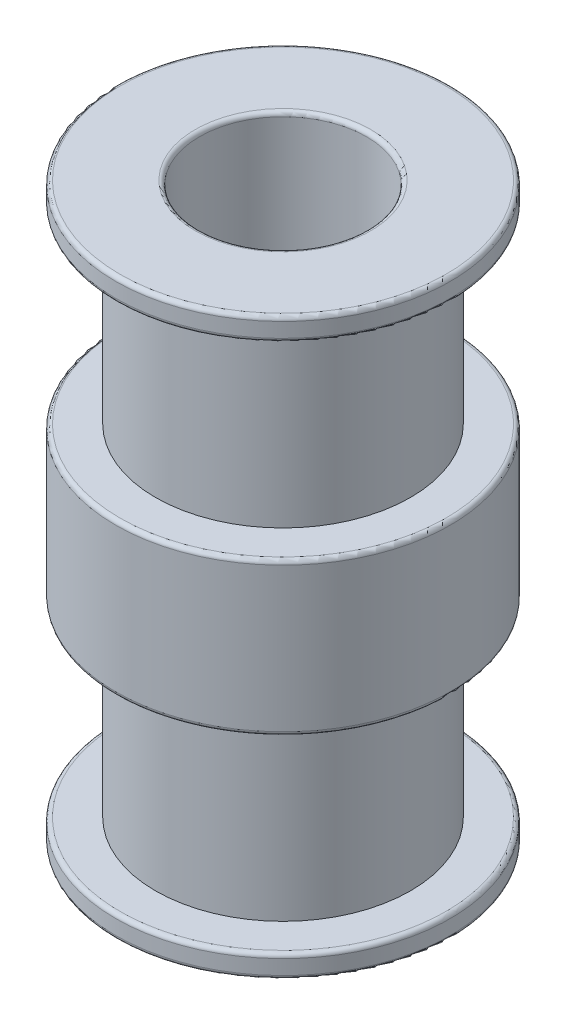
ISO-10303-21;
HEADER;
FILE_DESCRIPTION(('STEP AP214'),'2;1');
FILE_NAME('part.step','',(''),(''),'','','');
FILE_SCHEMA(('AUTOMOTIVE_DESIGN { 1 0 10303 214 1 1 1 1 }'));
ENDSEC;
DATA;
#1=APPLICATION_CONTEXT('core data for automotive mechanical design processes');
#2=APPLICATION_PROTOCOL_DEFINITION('international standard','automotive_design',2000,#1);
#3=PRODUCT_CONTEXT('',#1,'mechanical');
#4=PRODUCT('Part','Part','',(#3));
#5=PRODUCT_RELATED_PRODUCT_CATEGORY('part','',(#4));
#6=PRODUCT_DEFINITION_FORMATION('','',#4);
#7=PRODUCT_DEFINITION_CONTEXT('part definition',#1,'design');
#8=PRODUCT_DEFINITION('design','',#6,#7);
#9=PRODUCT_DEFINITION_SHAPE('','',#8);
#10=(LENGTH_UNIT() NAMED_UNIT(*) SI_UNIT(.MILLI.,.METRE.));
#11=(NAMED_UNIT(*) PLANE_ANGLE_UNIT() SI_UNIT($,.RADIAN.));
#12=(NAMED_UNIT(*) SI_UNIT($,.STERADIAN.) SOLID_ANGLE_UNIT());
#13=UNCERTAINTY_MEASURE_WITH_UNIT(LENGTH_MEASURE(1.E-05),#10,'distance_accuracy_value','');
#14=(GEOMETRIC_REPRESENTATION_CONTEXT(3) GLOBAL_UNCERTAINTY_ASSIGNED_CONTEXT((#13)) GLOBAL_UNIT_ASSIGNED_CONTEXT((#10,
#11,#12)) REPRESENTATION_CONTEXT('',''));
#15=CARTESIAN_POINT('',(0.,0.,0.));
#16=DIRECTION('',(0.,0.,1.));
#17=DIRECTION('',(1.,0.,0.));
#18=AXIS2_PLACEMENT_3D('',#15,#16,#17);
#19=CARTESIAN_POINT('',(0.,13.75,0.));
#20=DIRECTION('',(0.,-1.,0.));
#21=DIRECTION('',(0.,0.,-1.));
#22=AXIS2_PLACEMENT_3D('',#19,#20,#21);
#23=CYLINDRICAL_SURFACE('',#22,8.);
#24=CARTESIAN_POINT('',(0.,3.45,0.));
#25=DIRECTION('',(0.,1.,0.));
#26=DIRECTION('',(0.,0.,1.));
#27=AXIS2_PLACEMENT_3D('',#24,#25,#26);
#28=CIRCLE('',#27,8.);
#29=CARTESIAN_POINT('',(0.,3.45,8.));
#30=VERTEX_POINT('',#29);
#31=EDGE_CURVE('E44',#30,#30,#28,.F.);
#32=ORIENTED_EDGE('',*,*,#31,.T.);
#33=EDGE_LOOP('',(#32));
#34=FACE_BOUND('',#33,.T.);
#35=CARTESIAN_POINT('',(0.,-3.45,0.));
#36=DIRECTION('',(0.,-1.,0.));
#37=DIRECTION('',(0.,0.,-1.));
#38=AXIS2_PLACEMENT_3D('',#35,#36,#37);
#39=CIRCLE('',#38,8.);
#40=CARTESIAN_POINT('',(0.,-3.45,-8.));
#41=VERTEX_POINT('',#40);
#42=EDGE_CURVE('E47',#41,#41,#39,.F.);
#43=ORIENTED_EDGE('',*,*,#42,.T.);
#44=EDGE_LOOP('',(#43));
#45=FACE_BOUND('',#44,.T.);
#46=ADVANCED_FACE('F15',(#34,#45),#23,.T.);
#47=CARTESIAN_POINT('',(0.,-13.55,0.));
#48=DIRECTION('',(0.,1.,0.));
#49=DIRECTION('',(0.,0.,1.));
#50=AXIS2_PLACEMENT_3D('',#47,#48,#49);
#51=CIRCLE('',#50,8.);
#52=CARTESIAN_POINT('',(0.,-13.55,8.));
#53=VERTEX_POINT('',#52);
#54=EDGE_CURVE('E35',#53,#53,#51,.T.);
#55=ORIENTED_EDGE('',*,*,#54,.T.);
#56=EDGE_LOOP('',(#55));
#57=FACE_BOUND('',#56,.T.);
#58=CARTESIAN_POINT('',(0.,-12.85,0.));
#59=DIRECTION('',(0.,-1.,0.));
#60=DIRECTION('',(0.,0.,-1.));
#61=AXIS2_PLACEMENT_3D('',#58,#59,#60);
#62=CIRCLE('',#61,8.);
#63=CARTESIAN_POINT('',(0.,-12.85,-8.));
#64=VERTEX_POINT('',#63);
#65=EDGE_CURVE('E38',#64,#64,#62,.T.);
#66=ORIENTED_EDGE('',*,*,#65,.T.);
#67=EDGE_LOOP('',(#66));
#68=FACE_BOUND('',#67,.T.);
#69=ADVANCED_FACE('F107',(#57,#68),#23,.T.);
#70=CARTESIAN_POINT('',(0.,13.75,0.));
#71=DIRECTION('',(0.,1.,0.));
#72=DIRECTION('',(0.,0.,1.));
#73=AXIS2_PLACEMENT_3D('',#70,#71,#72);
#74=PLANE('',#73);
#75=CARTESIAN_POINT('',(0.,13.75,0.));
#76=DIRECTION('',(0.,1.,0.));
#77=DIRECTION('',(0.,0.,1.));
#78=AXIS2_PLACEMENT_3D('',#75,#76,#77);
#79=CIRCLE('',#78,4.2);
#80=CARTESIAN_POINT('',(0.,13.75,4.2));
#81=VERTEX_POINT('',#80);
#82=EDGE_CURVE('E53',#81,#81,#79,.F.);
#83=ORIENTED_EDGE('',*,*,#82,.T.);
#84=EDGE_LOOP('',(#83));
#85=FACE_BOUND('',#84,.T.);
#86=CARTESIAN_POINT('',(0.,13.75,0.));
#87=DIRECTION('',(0.,1.,0.));
#88=DIRECTION('',(0.,0.,1.));
#89=AXIS2_PLACEMENT_3D('',#86,#87,#88);
#90=CIRCLE('',#89,7.8);
#91=CARTESIAN_POINT('',(0.,13.75,7.8));
#92=VERTEX_POINT('',#91);
#93=EDGE_CURVE('E56',#92,#92,#90,.T.);
#94=ORIENTED_EDGE('',*,*,#93,.T.);
#95=EDGE_LOOP('',(#94));
#96=FACE_BOUND('',#95,.T.);
#97=ADVANCED_FACE('F115',(#85,#96),#74,.T.);
#98=CARTESIAN_POINT('',(0.,-13.75,0.));
#99=DIRECTION('',(0.,1.,0.));
#100=DIRECTION('',(0.,0.,1.));
#101=AXIS2_PLACEMENT_3D('',#98,#99,#100);
#102=PLANE('',#101);
#103=CARTESIAN_POINT('',(0.,-13.75,0.));
#104=DIRECTION('',(0.,1.,0.));
#105=DIRECTION('',(0.,0.,1.));
#106=AXIS2_PLACEMENT_3D('',#103,#104,#105);
#107=CIRCLE('',#106,4.2);
#108=CARTESIAN_POINT('',(0.,-13.75,4.2));
#109=VERTEX_POINT('',#108);
#110=EDGE_CURVE('E65',#109,#109,#107,.T.);
#111=ORIENTED_EDGE('',*,*,#110,.T.);
#112=EDGE_LOOP('',(#111));
#113=FACE_BOUND('',#112,.T.);
#114=CARTESIAN_POINT('',(0.,-13.75,0.));
#115=DIRECTION('',(0.,1.,0.));
#116=DIRECTION('',(0.,0.,1.));
#117=AXIS2_PLACEMENT_3D('',#114,#115,#116);
#118=CIRCLE('',#117,7.8);
#119=CARTESIAN_POINT('',(0.,-13.75,7.8));
#120=VERTEX_POINT('',#119);
#121=EDGE_CURVE('E68',#120,#120,#118,.F.);
#122=ORIENTED_EDGE('',*,*,#121,.T.);
#123=EDGE_LOOP('',(#122));
#124=FACE_BOUND('',#123,.T.);
#125=ADVANCED_FACE('F122',(#113,#124),#102,.F.);
#126=CARTESIAN_POINT('',(0.,12.85,0.));
#127=DIRECTION('',(0.,1.,0.));
#128=DIRECTION('',(0.,0.,1.));
#129=AXIS2_PLACEMENT_3D('',#126,#127,#128);
#130=CIRCLE('',#129,8.);
#131=CARTESIAN_POINT('',(0.,12.85,8.));
#132=VERTEX_POINT('',#131);
#133=EDGE_CURVE('E22',#132,#132,#130,.T.);
#134=ORIENTED_EDGE('',*,*,#133,.T.);
#135=EDGE_LOOP('',(#134));
#136=FACE_BOUND('',#135,.T.);
#137=CARTESIAN_POINT('',(0.,13.55,0.));
#138=DIRECTION('',(0.,1.,0.));
#139=DIRECTION('',(0.,0.,1.));
#140=AXIS2_PLACEMENT_3D('',#137,#138,#139);
#141=CIRCLE('',#140,8.);
#142=CARTESIAN_POINT('',(0.,13.55,8.));
#143=VERTEX_POINT('',#142);
#144=EDGE_CURVE('E26',#143,#143,#141,.F.);
#145=ORIENTED_EDGE('',*,*,#144,.T.);
#146=EDGE_LOOP('',(#145));
#147=FACE_BOUND('',#146,.T.);
#148=ADVANCED_FACE('F110',(#136,#147),#23,.T.);
#149=CARTESIAN_POINT('',(0.,13.75,0.));
#150=DIRECTION('',(0.,-1.,0.));
#151=DIRECTION('',(0.,0.,-1.));
#152=AXIS2_PLACEMENT_3D('',#149,#150,#151);
#153=CYLINDRICAL_SURFACE('',#152,4.);
#154=CARTESIAN_POINT('',(0.,-13.55,0.));
#155=DIRECTION('',(0.,1.,0.));
#156=DIRECTION('',(0.,0.,1.));
#157=AXIS2_PLACEMENT_3D('',#154,#155,#156);
#158=CIRCLE('',#157,4.);
#159=CARTESIAN_POINT('',(0.,-13.55,4.));
#160=VERTEX_POINT('',#159);
#161=EDGE_CURVE('E59',#160,#160,#158,.F.);
#162=ORIENTED_EDGE('',*,*,#161,.T.);
#163=EDGE_LOOP('',(#162));
#164=FACE_BOUND('',#163,.T.);
#165=CARTESIAN_POINT('',(0.,13.55,0.));
#166=DIRECTION('',(0.,1.,0.));
#167=DIRECTION('',(0.,0.,1.));
#168=AXIS2_PLACEMENT_3D('',#165,#166,#167);
#169=CIRCLE('',#168,4.);
#170=CARTESIAN_POINT('',(0.,13.55,4.));
#171=VERTEX_POINT('',#170);
#172=EDGE_CURVE('E62',#171,#171,#169,.T.);
#173=ORIENTED_EDGE('',*,*,#172,.T.);
#174=EDGE_LOOP('',(#173));
#175=FACE_BOUND('',#174,.T.);
#176=ADVANCED_FACE('F121',(#164,#175),#153,.F.);
#177=CARTESIAN_POINT('',(0.,3.65,0.));
#178=DIRECTION('',(0.,1.,0.));
#179=DIRECTION('',(0.,0.,1.));
#180=AXIS2_PLACEMENT_3D('',#177,#178,#179);
#181=PLANE('',#180);
#182=CARTESIAN_POINT('',(0.,3.65,0.));
#183=DIRECTION('',(0.,1.,0.));
#184=DIRECTION('',(0.,0.,1.));
#185=AXIS2_PLACEMENT_3D('',#182,#183,#184);
#186=CIRCLE('',#185,7.8);
#187=CARTESIAN_POINT('',(0.,3.65,7.8));
#188=VERTEX_POINT('',#187);
#189=EDGE_CURVE('E50',#188,#188,#186,.T.);
#190=ORIENTED_EDGE('',*,*,#189,.T.);
#191=EDGE_LOOP('',(#190));
#192=FACE_BOUND('',#191,.T.);
#193=CARTESIAN_POINT('',(0.,3.65,0.));
#194=DIRECTION('',(0.,1.,0.));
#195=DIRECTION('',(0.,0.,1.));
#196=AXIS2_PLACEMENT_3D('',#193,#194,#195);
#197=CIRCLE('',#196,6.1);
#198=CARTESIAN_POINT('',(0.,3.65,6.1));
#199=VERTEX_POINT('',#198);
#200=EDGE_CURVE('E71',#199,#199,#197,.T.);
#201=ORIENTED_EDGE('',*,*,#200,.F.);
#202=EDGE_LOOP('',(#201));
#203=FACE_BOUND('',#202,.T.);
#204=ADVANCED_FACE('F128',(#192,#203),#181,.T.);
#205=CARTESIAN_POINT('',(0.,12.65,0.));
#206=DIRECTION('',(0.,1.,0.));
#207=DIRECTION('',(0.,0.,1.));
#208=AXIS2_PLACEMENT_3D('',#205,#206,#207);
#209=PLANE('',#208);
#210=CARTESIAN_POINT('',(0.,12.65,0.));
#211=DIRECTION('',(0.,1.,0.));
#212=DIRECTION('',(0.,0.,1.));
#213=AXIS2_PLACEMENT_3D('',#210,#211,#212);
#214=CIRCLE('',#213,7.8);
#215=CARTESIAN_POINT('',(0.,12.65,7.8));
#216=VERTEX_POINT('',#215);
#217=EDGE_CURVE('E10',#216,#216,#214,.F.);
#218=ORIENTED_EDGE('',*,*,#217,.T.);
#219=EDGE_LOOP('',(#218));
#220=FACE_BOUND('',#219,.T.);
#221=CARTESIAN_POINT('',(0.,12.65,0.));
#222=DIRECTION('',(0.,1.,0.));
#223=DIRECTION('',(0.,0.,1.));
#224=AXIS2_PLACEMENT_3D('',#221,#222,#223);
#225=CIRCLE('',#224,6.1);
#226=CARTESIAN_POINT('',(0.,12.65,6.1));
#227=VERTEX_POINT('',#226);
#228=EDGE_CURVE('E72',#227,#227,#225,.T.);
#229=ORIENTED_EDGE('',*,*,#228,.T.);
#230=EDGE_LOOP('',(#229));
#231=FACE_BOUND('',#230,.T.);
#232=ADVANCED_FACE('F147',(#220,#231),#209,.F.);
#233=CARTESIAN_POINT('',(0.,3.65,0.));
#234=DIRECTION('',(0.,1.,0.));
#235=DIRECTION('',(0.,0.,1.));
#236=AXIS2_PLACEMENT_3D('',#233,#234,#235);
#237=CYLINDRICAL_SURFACE('',#236,6.1);
#238=ORIENTED_EDGE('',*,*,#200,.T.);
#239=EDGE_LOOP('',(#238));
#240=FACE_BOUND('',#239,.T.);
#241=ORIENTED_EDGE('',*,*,#228,.F.);
#242=EDGE_LOOP('',(#241));
#243=FACE_BOUND('',#242,.T.);
#244=ADVANCED_FACE('F102',(#240,#243),#237,.T.);
#245=CARTESIAN_POINT('',(0.,-3.65,0.));
#246=DIRECTION('',(0.,-1.,0.));
#247=DIRECTION('',(0.,0.,-1.));
#248=AXIS2_PLACEMENT_3D('',#245,#246,#247);
#249=PLANE('',#248);
#250=CARTESIAN_POINT('',(0.,-3.65,0.));
#251=DIRECTION('',(0.,-1.,0.));
#252=DIRECTION('',(0.,0.,-1.));
#253=AXIS2_PLACEMENT_3D('',#250,#251,#252);
#254=CIRCLE('',#253,7.8);
#255=CARTESIAN_POINT('',(0.,-3.65,-7.8));
#256=VERTEX_POINT('',#255);
#257=EDGE_CURVE('E41',#256,#256,#254,.T.);
#258=ORIENTED_EDGE('',*,*,#257,.T.);
#259=EDGE_LOOP('',(#258));
#260=FACE_BOUND('',#259,.T.);
#261=CARTESIAN_POINT('',(0.,-3.65,0.));
#262=DIRECTION('',(0.,1.,0.));
#263=DIRECTION('',(0.,0.,1.));
#264=AXIS2_PLACEMENT_3D('',#261,#262,#263);
#265=CIRCLE('',#264,6.1);
#266=CARTESIAN_POINT('',(0.,-3.65,6.1));
#267=VERTEX_POINT('',#266);
#268=EDGE_CURVE('E75',#267,#267,#265,.T.);
#269=ORIENTED_EDGE('',*,*,#268,.T.);
#270=EDGE_LOOP('',(#269));
#271=FACE_BOUND('',#270,.T.);
#272=ADVANCED_FACE('F84',(#260,#271),#249,.T.);
#273=CARTESIAN_POINT('',(0.,-12.65,0.));
#274=DIRECTION('',(0.,-1.,0.));
#275=DIRECTION('',(0.,0.,-1.));
#276=AXIS2_PLACEMENT_3D('',#273,#274,#275);
#277=PLANE('',#276);
#278=CARTESIAN_POINT('',(0.,-12.65,0.));
#279=DIRECTION('',(0.,-1.,0.));
#280=DIRECTION('',(0.,0.,-1.));
#281=AXIS2_PLACEMENT_3D('',#278,#279,#280);
#282=CIRCLE('',#281,7.8);
#283=CARTESIAN_POINT('',(0.,-12.65,-7.8));
#284=VERTEX_POINT('',#283);
#285=EDGE_CURVE('E30',#284,#284,#282,.F.);
#286=ORIENTED_EDGE('',*,*,#285,.T.);
#287=EDGE_LOOP('',(#286));
#288=FACE_BOUND('',#287,.T.);
#289=CARTESIAN_POINT('',(0.,-12.65,0.));
#290=DIRECTION('',(0.,1.,0.));
#291=DIRECTION('',(0.,0.,1.));
#292=AXIS2_PLACEMENT_3D('',#289,#290,#291);
#293=CIRCLE('',#292,6.1);
#294=CARTESIAN_POINT('',(0.,-12.65,6.1));
#295=VERTEX_POINT('',#294);
#296=EDGE_CURVE('E78',#295,#295,#293,.T.);
#297=ORIENTED_EDGE('',*,*,#296,.F.);
#298=EDGE_LOOP('',(#297));
#299=FACE_BOUND('',#298,.T.);
#300=ADVANCED_FACE('F90',(#288,#299),#277,.F.);
#301=CARTESIAN_POINT('',(0.,-3.65,0.));
#302=DIRECTION('',(0.,-1.,0.));
#303=DIRECTION('',(0.,0.,-1.));
#304=AXIS2_PLACEMENT_3D('',#301,#302,#303);
#305=CYLINDRICAL_SURFACE('',#304,6.1);
#306=ORIENTED_EDGE('',*,*,#268,.F.);
#307=EDGE_LOOP('',(#306));
#308=FACE_BOUND('',#307,.T.);
#309=ORIENTED_EDGE('',*,*,#296,.T.);
#310=EDGE_LOOP('',(#309));
#311=FACE_BOUND('',#310,.T.);
#312=ADVANCED_FACE('F86',(#308,#311),#305,.T.);
#313=CARTESIAN_POINT('',(0.,-13.55,0.));
#314=DIRECTION('',(0.,1.,0.));
#315=DIRECTION('',(0.,0.,1.));
#316=AXIS2_PLACEMENT_3D('',#313,#314,#315);
#317=TOROIDAL_SURFACE('',#316,4.2,0.2);
#318=ORIENTED_EDGE('',*,*,#161,.F.);
#319=EDGE_LOOP('',(#318));
#320=FACE_BOUND('',#319,.T.);
#321=ORIENTED_EDGE('',*,*,#110,.F.);
#322=EDGE_LOOP('',(#321));
#323=FACE_BOUND('',#322,.T.);
#324=ADVANCED_FACE('F89',(#320,#323),#317,.T.);
#325=CARTESIAN_POINT('',(0.,13.55,0.));
#326=DIRECTION('',(0.,1.,0.));
#327=DIRECTION('',(0.,0.,1.));
#328=AXIS2_PLACEMENT_3D('',#325,#326,#327);
#329=TOROIDAL_SURFACE('',#328,4.2,0.2);
#330=ORIENTED_EDGE('',*,*,#82,.F.);
#331=EDGE_LOOP('',(#330));
#332=FACE_BOUND('',#331,.T.);
#333=ORIENTED_EDGE('',*,*,#172,.F.);
#334=EDGE_LOOP('',(#333));
#335=FACE_BOUND('',#334,.T.);
#336=ADVANCED_FACE('F193',(#332,#335),#329,.T.);
#337=CARTESIAN_POINT('',(0.,3.45,0.));
#338=DIRECTION('',(0.,1.,0.));
#339=DIRECTION('',(0.,0.,1.));
#340=AXIS2_PLACEMENT_3D('',#337,#338,#339);
#341=TOROIDAL_SURFACE('',#340,7.8,0.2);
#342=ORIENTED_EDGE('',*,*,#31,.F.);
#343=EDGE_LOOP('',(#342));
#344=FACE_BOUND('',#343,.T.);
#345=ORIENTED_EDGE('',*,*,#189,.F.);
#346=EDGE_LOOP('',(#345));
#347=FACE_BOUND('',#346,.T.);
#348=ADVANCED_FACE('F202',(#344,#347),#341,.T.);
#349=CARTESIAN_POINT('',(0.,-3.45,0.));
#350=DIRECTION('',(0.,-1.,0.));
#351=DIRECTION('',(0.,0.,-1.));
#352=AXIS2_PLACEMENT_3D('',#349,#350,#351);
#353=TOROIDAL_SURFACE('',#352,7.8,0.2);
#354=ORIENTED_EDGE('',*,*,#42,.F.);
#355=EDGE_LOOP('',(#354));
#356=FACE_BOUND('',#355,.T.);
#357=ORIENTED_EDGE('',*,*,#257,.F.);
#358=EDGE_LOOP('',(#357));
#359=FACE_BOUND('',#358,.T.);
#360=ADVANCED_FACE('F212',(#356,#359),#353,.T.);
#361=CARTESIAN_POINT('',(0.,-13.55,0.));
#362=DIRECTION('',(0.,1.,0.));
#363=DIRECTION('',(0.,0.,1.));
#364=AXIS2_PLACEMENT_3D('',#361,#362,#363);
#365=TOROIDAL_SURFACE('',#364,7.8,0.2);
#366=ORIENTED_EDGE('',*,*,#121,.F.);
#367=EDGE_LOOP('',(#366));
#368=FACE_BOUND('',#367,.T.);
#369=ORIENTED_EDGE('',*,*,#54,.F.);
#370=EDGE_LOOP('',(#369));
#371=FACE_BOUND('',#370,.T.);
#372=ADVANCED_FACE('F222',(#368,#371),#365,.T.);
#373=CARTESIAN_POINT('',(0.,-12.85,0.));
#374=DIRECTION('',(0.,-1.,0.));
#375=DIRECTION('',(0.,0.,-1.));
#376=AXIS2_PLACEMENT_3D('',#373,#374,#375);
#377=TOROIDAL_SURFACE('',#376,7.8,0.2);
#378=ORIENTED_EDGE('',*,*,#285,.F.);
#379=EDGE_LOOP('',(#378));
#380=FACE_BOUND('',#379,.T.);
#381=ORIENTED_EDGE('',*,*,#65,.F.);
#382=EDGE_LOOP('',(#381));
#383=FACE_BOUND('',#382,.T.);
#384=ADVANCED_FACE('F232',(#380,#383),#377,.T.);
#385=CARTESIAN_POINT('',(0.,12.85,0.));
#386=DIRECTION('',(0.,1.,0.));
#387=DIRECTION('',(0.,0.,1.));
#388=AXIS2_PLACEMENT_3D('',#385,#386,#387);
#389=TOROIDAL_SURFACE('',#388,7.8,0.2);
#390=ORIENTED_EDGE('',*,*,#217,.F.);
#391=EDGE_LOOP('',(#390));
#392=FACE_BOUND('',#391,.T.);
#393=ORIENTED_EDGE('',*,*,#133,.F.);
#394=EDGE_LOOP('',(#393));
#395=FACE_BOUND('',#394,.T.);
#396=ADVANCED_FACE('F137',(#392,#395),#389,.T.);
#397=CARTESIAN_POINT('',(0.,13.55,0.));
#398=DIRECTION('',(0.,1.,0.));
#399=DIRECTION('',(0.,0.,1.));
#400=AXIS2_PLACEMENT_3D('',#397,#398,#399);
#401=TOROIDAL_SURFACE('',#400,7.8,0.2);
#402=ORIENTED_EDGE('',*,*,#144,.F.);
#403=EDGE_LOOP('',(#402));
#404=FACE_BOUND('',#403,.T.);
#405=ORIENTED_EDGE('',*,*,#93,.F.);
#406=EDGE_LOOP('',(#405));
#407=FACE_BOUND('',#406,.T.);
#408=ADVANCED_FACE('F17',(#404,#407),#401,.T.);
#409=CLOSED_SHELL('',(#46,#69,#97,#125,#148,#176,#204,#232,#244,#272,#300,#312,#324,#336,#348,
#360,#372,#384,#396,#408));
#410=MANIFOLD_SOLID_BREP('B1',#409);
#411=ADVANCED_BREP_SHAPE_REPRESENTATION('',(#18,#410),#14);
#412=SHAPE_DEFINITION_REPRESENTATION(#9,#411);
ENDSEC;
END-ISO-10303-21;
